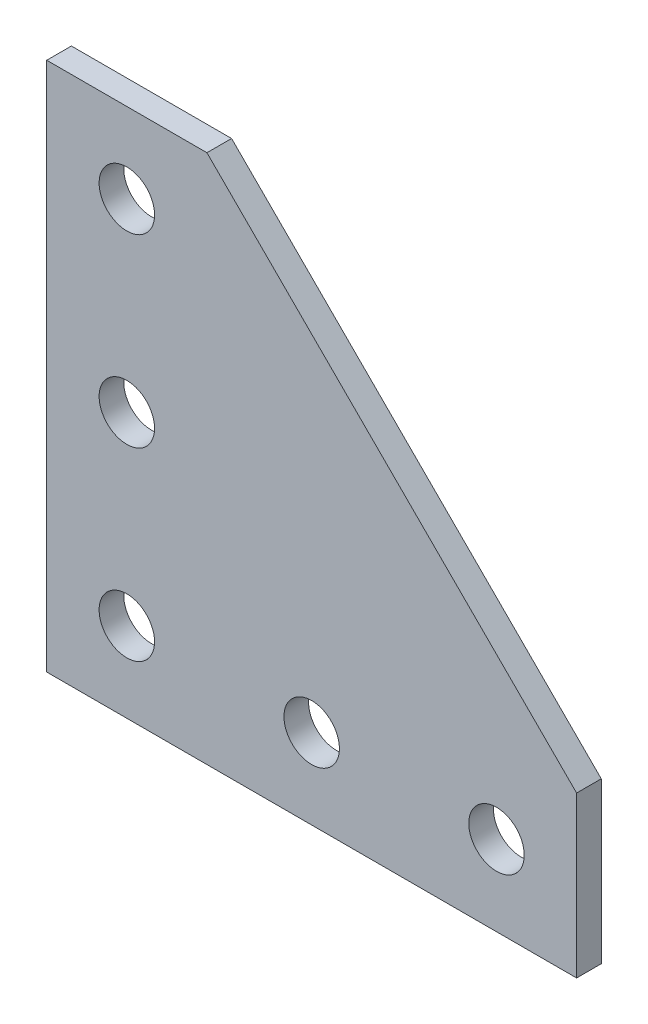
ISO-10303-21;
HEADER;
FILE_DESCRIPTION(('STEP AP214'),'2;1');
FILE_NAME('part.step','',(''),(''),'','','');
FILE_SCHEMA(('AUTOMOTIVE_DESIGN { 1 0 10303 214 1 1 1 1 }'));
ENDSEC;
DATA;
#1=APPLICATION_CONTEXT('core data for automotive mechanical design processes');
#2=APPLICATION_PROTOCOL_DEFINITION('international standard','automotive_design',2000,#1);
#3=PRODUCT_CONTEXT('',#1,'mechanical');
#4=PRODUCT('Part','Part','',(#3));
#5=PRODUCT_RELATED_PRODUCT_CATEGORY('part','',(#4));
#6=PRODUCT_DEFINITION_FORMATION('','',#4);
#7=PRODUCT_DEFINITION_CONTEXT('part definition',#1,'design');
#8=PRODUCT_DEFINITION('design','',#6,#7);
#9=PRODUCT_DEFINITION_SHAPE('','',#8);
#10=(LENGTH_UNIT() NAMED_UNIT(*) SI_UNIT(.MILLI.,.METRE.));
#11=(NAMED_UNIT(*) PLANE_ANGLE_UNIT() SI_UNIT($,.RADIAN.));
#12=(NAMED_UNIT(*) SI_UNIT($,.STERADIAN.) SOLID_ANGLE_UNIT());
#13=UNCERTAINTY_MEASURE_WITH_UNIT(LENGTH_MEASURE(1.E-05),#10,'distance_accuracy_value','');
#14=(GEOMETRIC_REPRESENTATION_CONTEXT(3) GLOBAL_UNCERTAINTY_ASSIGNED_CONTEXT((#13)) GLOBAL_UNIT_ASSIGNED_CONTEXT((#10,
#11,#12)) REPRESENTATION_CONTEXT('',''));
#15=CARTESIAN_POINT('',(0.,0.,0.));
#16=DIRECTION('',(0.,0.,1.));
#17=DIRECTION('',(1.,0.,0.));
#18=AXIS2_PLACEMENT_3D('',#15,#16,#17);
#19=CARTESIAN_POINT('',(-88.9000000000006,47.625,3.175));
#20=DIRECTION('',(0.,0.,-1.));
#21=DIRECTION('',(-1.,0.,0.));
#22=AXIS2_PLACEMENT_3D('',#19,#20,#21);
#23=PLANE('',#22);
#24=DIRECTION('',(0.,-1.,0.));
#25=VECTOR('',#24,1.);
#26=CARTESIAN_POINT('',(-88.9000000000006,-88.9,3.175));
#27=LINE('',#26,#25);
#28=CARTESIAN_POINT('',(-88.9000000000006,47.625,3.175));
#29=VERTEX_POINT('',#28);
#30=CARTESIAN_POINT('',(-88.9000000000006,-88.9,3.175));
#31=VERTEX_POINT('',#30);
#32=EDGE_CURVE('E135',#29,#31,#27,.T.);
#33=ORIENTED_EDGE('',*,*,#32,.T.);
#34=DIRECTION('',(1.,0.,0.));
#35=VECTOR('',#34,1.);
#36=CARTESIAN_POINT('',(47.6250000000006,-88.9,3.175));
#37=LINE('',#36,#35);
#38=CARTESIAN_POINT('',(47.6250000000006,-88.9,3.175));
#39=VERTEX_POINT('',#38);
#40=EDGE_CURVE('E93',#31,#39,#37,.T.);
#41=ORIENTED_EDGE('',*,*,#40,.T.);
#42=DIRECTION('',(0.,1.,0.));
#43=VECTOR('',#42,1.);
#44=CARTESIAN_POINT('',(47.6250000000006,-47.625,3.175));
#45=LINE('',#44,#43);
#46=CARTESIAN_POINT('',(47.6250000000006,-47.625,3.175));
#47=VERTEX_POINT('',#46);
#48=EDGE_CURVE('E97',#39,#47,#45,.T.);
#49=ORIENTED_EDGE('',*,*,#48,.T.);
#50=DIRECTION('',(-0.707106781186552,0.707106781186543,0.));
#51=VECTOR('',#50,1.);
#52=CARTESIAN_POINT('',(-47.6250000000006,47.625,3.175));
#53=LINE('',#52,#51);
#54=CARTESIAN_POINT('',(-47.6250000000006,47.625,3.175));
#55=VERTEX_POINT('',#54);
#56=EDGE_CURVE('E101',#47,#55,#53,.T.);
#57=ORIENTED_EDGE('',*,*,#56,.T.);
#58=DIRECTION('',(-1.,0.,0.));
#59=VECTOR('',#58,1.);
#60=CARTESIAN_POINT('',(-88.9000000000006,47.625,3.175));
#61=LINE('',#60,#59);
#62=EDGE_CURVE('E59',#55,#29,#61,.T.);
#63=ORIENTED_EDGE('',*,*,#62,.T.);
#64=EDGE_LOOP('',(#33,#41,#49,#57,#63));
#65=FACE_BOUND('',#64,.T.);
#66=CARTESIAN_POINT('',(-68.2625000000005,-68.2625,3.175));
#67=DIRECTION('',(0.,0.,1.));
#68=DIRECTION('',(1.,0.,0.));
#69=AXIS2_PLACEMENT_3D('',#66,#67,#68);
#70=CIRCLE('',#69,7.14374999999999);
#71=CARTESIAN_POINT('',(-61.1187500000005,-68.2625,3.175));
#72=VERTEX_POINT('',#71);
#73=EDGE_CURVE('E126',#72,#72,#70,.T.);
#74=ORIENTED_EDGE('',*,*,#73,.F.);
#75=EDGE_LOOP('',(#74));
#76=FACE_BOUND('',#75,.T.);
#77=CARTESIAN_POINT('',(-68.2625000000006,-20.6375,3.175));
#78=DIRECTION('',(0.,0.,1.));
#79=DIRECTION('',(1.,0.,0.));
#80=AXIS2_PLACEMENT_3D('',#77,#78,#79);
#81=CIRCLE('',#80,7.14375);
#82=CARTESIAN_POINT('',(-61.1187500000006,-20.6375,3.175));
#83=VERTEX_POINT('',#82);
#84=EDGE_CURVE('E213',#83,#83,#81,.T.);
#85=ORIENTED_EDGE('',*,*,#84,.F.);
#86=EDGE_LOOP('',(#85));
#87=FACE_BOUND('',#86,.T.);
#88=CARTESIAN_POINT('',(-68.2625000000006,26.9875,3.175));
#89=DIRECTION('',(0.,0.,1.));
#90=DIRECTION('',(1.,0.,0.));
#91=AXIS2_PLACEMENT_3D('',#88,#89,#90);
#92=CIRCLE('',#91,7.14375);
#93=CARTESIAN_POINT('',(-61.1187500000006,26.9875,3.175));
#94=VERTEX_POINT('',#93);
#95=EDGE_CURVE('E205',#94,#94,#92,.T.);
#96=ORIENTED_EDGE('',*,*,#95,.F.);
#97=EDGE_LOOP('',(#96));
#98=FACE_BOUND('',#97,.T.);
#99=CARTESIAN_POINT('',(-20.6375000000005,-68.2625,3.175));
#100=DIRECTION('',(0.,0.,1.));
#101=DIRECTION('',(1.,0.,0.));
#102=AXIS2_PLACEMENT_3D('',#99,#100,#101);
#103=CIRCLE('',#102,7.14375);
#104=CARTESIAN_POINT('',(-13.4937500000005,-68.2625,3.175));
#105=VERTEX_POINT('',#104);
#106=EDGE_CURVE('E197',#105,#105,#103,.T.);
#107=ORIENTED_EDGE('',*,*,#106,.F.);
#108=EDGE_LOOP('',(#107));
#109=FACE_BOUND('',#108,.T.);
#110=CARTESIAN_POINT('',(26.9874999999995,-68.2625,3.175));
#111=DIRECTION('',(0.,0.,1.));
#112=DIRECTION('',(1.,0.,0.));
#113=AXIS2_PLACEMENT_3D('',#110,#111,#112);
#114=CIRCLE('',#113,7.14374999999999);
#115=CARTESIAN_POINT('',(34.1312499999995,-68.2625,3.175));
#116=VERTEX_POINT('',#115);
#117=EDGE_CURVE('E186',#116,#116,#114,.T.);
#118=ORIENTED_EDGE('',*,*,#117,.F.);
#119=EDGE_LOOP('',(#118));
#120=FACE_BOUND('',#119,.T.);
#121=ADVANCED_FACE('F41',(#65,#76,#87,#98,#109,#120),#23,.F.);
#122=CARTESIAN_POINT('',(-88.9000000000006,47.625,-3.175));
#123=DIRECTION('',(0.,0.,-1.));
#124=DIRECTION('',(-1.,0.,0.));
#125=AXIS2_PLACEMENT_3D('',#122,#123,#124);
#126=PLANE('',#125);
#127=CARTESIAN_POINT('',(-20.6375000000005,-68.2625,-3.175));
#128=DIRECTION('',(0.,0.,1.));
#129=DIRECTION('',(1.,0.,0.));
#130=AXIS2_PLACEMENT_3D('',#127,#128,#129);
#131=CIRCLE('',#130,7.14375);
#132=CARTESIAN_POINT('',(-13.4937500000005,-68.2625,-3.175));
#133=VERTEX_POINT('',#132);
#134=EDGE_CURVE('E194',#133,#133,#131,.T.);
#135=ORIENTED_EDGE('',*,*,#134,.T.);
#136=EDGE_LOOP('',(#135));
#137=FACE_BOUND('',#136,.T.);
#138=CARTESIAN_POINT('',(-68.2625000000006,-20.6375,-3.175));
#139=DIRECTION('',(0.,0.,1.));
#140=DIRECTION('',(1.,0.,0.));
#141=AXIS2_PLACEMENT_3D('',#138,#139,#140);
#142=CIRCLE('',#141,7.14375);
#143=CARTESIAN_POINT('',(-61.1187500000006,-20.6375,-3.175));
#144=VERTEX_POINT('',#143);
#145=EDGE_CURVE('E209',#144,#144,#142,.T.);
#146=ORIENTED_EDGE('',*,*,#145,.T.);
#147=EDGE_LOOP('',(#146));
#148=FACE_BOUND('',#147,.T.);
#149=DIRECTION('',(0.,-1.,0.));
#150=VECTOR('',#149,1.);
#151=CARTESIAN_POINT('',(-88.9000000000006,-88.9,-3.175));
#152=LINE('',#151,#150);
#153=CARTESIAN_POINT('',(-88.9000000000006,47.625,-3.175));
#154=VERTEX_POINT('',#153);
#155=CARTESIAN_POINT('',(-88.9000000000006,-88.9,-3.175));
#156=VERTEX_POINT('',#155);
#157=EDGE_CURVE('E121',#154,#156,#152,.T.);
#158=ORIENTED_EDGE('',*,*,#157,.F.);
#159=DIRECTION('',(-1.,0.,0.));
#160=VECTOR('',#159,1.);
#161=CARTESIAN_POINT('',(-88.9000000000006,47.625,-3.175));
#162=LINE('',#161,#160);
#163=CARTESIAN_POINT('',(-47.6250000000006,47.625,-3.175));
#164=VERTEX_POINT('',#163);
#165=EDGE_CURVE('E85',#164,#154,#162,.T.);
#166=ORIENTED_EDGE('',*,*,#165,.F.);
#167=DIRECTION('',(-0.707106781186552,0.707106781186543,0.));
#168=VECTOR('',#167,1.);
#169=CARTESIAN_POINT('',(-47.6250000000006,47.625,-3.175));
#170=LINE('',#169,#168);
#171=CARTESIAN_POINT('',(47.6250000000006,-47.625,-3.175));
#172=VERTEX_POINT('',#171);
#173=EDGE_CURVE('E79',#172,#164,#170,.T.);
#174=ORIENTED_EDGE('',*,*,#173,.F.);
#175=DIRECTION('',(0.,1.,0.));
#176=VECTOR('',#175,1.);
#177=CARTESIAN_POINT('',(47.6250000000006,-47.625,-3.175));
#178=LINE('',#177,#176);
#179=CARTESIAN_POINT('',(47.6250000000006,-88.9,-3.175));
#180=VERTEX_POINT('',#179);
#181=EDGE_CURVE('E109',#180,#172,#178,.T.);
#182=ORIENTED_EDGE('',*,*,#181,.F.);
#183=DIRECTION('',(1.,0.,0.));
#184=VECTOR('',#183,1.);
#185=CARTESIAN_POINT('',(47.6250000000006,-88.9,-3.175));
#186=LINE('',#185,#184);
#187=EDGE_CURVE('E125',#156,#180,#186,.T.);
#188=ORIENTED_EDGE('',*,*,#187,.F.);
#189=EDGE_LOOP('',(#158,#166,#174,#182,#188));
#190=FACE_BOUND('',#189,.T.);
#191=CARTESIAN_POINT('',(-68.2625000000005,-68.2625,-3.175));
#192=DIRECTION('',(0.,0.,1.));
#193=DIRECTION('',(1.,0.,0.));
#194=AXIS2_PLACEMENT_3D('',#191,#192,#193);
#195=CIRCLE('',#194,7.14374999999999);
#196=CARTESIAN_POINT('',(-61.1187500000005,-68.2625,-3.175));
#197=VERTEX_POINT('',#196);
#198=EDGE_CURVE('E217',#197,#197,#195,.T.);
#199=ORIENTED_EDGE('',*,*,#198,.T.);
#200=EDGE_LOOP('',(#199));
#201=FACE_BOUND('',#200,.T.);
#202=CARTESIAN_POINT('',(-68.2625000000006,26.9875,-3.175));
#203=DIRECTION('',(0.,0.,1.));
#204=DIRECTION('',(1.,0.,0.));
#205=AXIS2_PLACEMENT_3D('',#202,#203,#204);
#206=CIRCLE('',#205,7.14375);
#207=CARTESIAN_POINT('',(-61.1187500000006,26.9875,-3.175));
#208=VERTEX_POINT('',#207);
#209=EDGE_CURVE('E201',#208,#208,#206,.T.);
#210=ORIENTED_EDGE('',*,*,#209,.T.);
#211=EDGE_LOOP('',(#210));
#212=FACE_BOUND('',#211,.T.);
#213=CARTESIAN_POINT('',(26.9874999999995,-68.2625,-3.175));
#214=DIRECTION('',(0.,0.,1.));
#215=DIRECTION('',(1.,0.,0.));
#216=AXIS2_PLACEMENT_3D('',#213,#214,#215);
#217=CIRCLE('',#216,7.14374999999999);
#218=CARTESIAN_POINT('',(34.1312499999995,-68.2625,-3.175));
#219=VERTEX_POINT('',#218);
#220=EDGE_CURVE('E189',#219,#219,#217,.T.);
#221=ORIENTED_EDGE('',*,*,#220,.T.);
#222=EDGE_LOOP('',(#221));
#223=FACE_BOUND('',#222,.T.);
#224=ADVANCED_FACE('F142',(#137,#148,#190,#201,#212,#223),#126,.T.);
#225=CARTESIAN_POINT('',(-88.9000000000006,-88.9,3.175));
#226=DIRECTION('',(1.,0.,0.));
#227=DIRECTION('',(0.,0.,-1.));
#228=AXIS2_PLACEMENT_3D('',#225,#226,#227);
#229=PLANE('',#228);
#230=ORIENTED_EDGE('',*,*,#157,.T.);
#231=DIRECTION('',(0.,0.,-1.));
#232=VECTOR('',#231,1.);
#233=CARTESIAN_POINT('',(-88.9000000000006,-88.9,3.175));
#234=LINE('',#233,#232);
#235=EDGE_CURVE('E11',#31,#156,#234,.T.);
#236=ORIENTED_EDGE('',*,*,#235,.F.);
#237=ORIENTED_EDGE('',*,*,#32,.F.);
#238=DIRECTION('',(0.,0.,-1.));
#239=VECTOR('',#238,1.);
#240=CARTESIAN_POINT('',(-88.9000000000006,47.625,3.175));
#241=LINE('',#240,#239);
#242=EDGE_CURVE('E117',#29,#154,#241,.T.);
#243=ORIENTED_EDGE('',*,*,#242,.T.);
#244=EDGE_LOOP('',(#230,#236,#237,#243));
#245=FACE_BOUND('',#244,.T.);
#246=ADVANCED_FACE('F43',(#245),#229,.F.);
#247=CARTESIAN_POINT('',(47.6250000000006,-88.9,3.175));
#248=DIRECTION('',(0.,1.,0.));
#249=DIRECTION('',(-1.,0.,0.));
#250=AXIS2_PLACEMENT_3D('',#247,#248,#249);
#251=PLANE('',#250);
#252=ORIENTED_EDGE('',*,*,#187,.T.);
#253=DIRECTION('',(0.,0.,-1.));
#254=VECTOR('',#253,1.);
#255=CARTESIAN_POINT('',(47.6250000000006,-88.9,3.175));
#256=LINE('',#255,#254);
#257=EDGE_CURVE('E51',#39,#180,#256,.T.);
#258=ORIENTED_EDGE('',*,*,#257,.F.);
#259=ORIENTED_EDGE('',*,*,#40,.F.);
#260=ORIENTED_EDGE('',*,*,#235,.T.);
#261=EDGE_LOOP('',(#252,#258,#259,#260));
#262=FACE_BOUND('',#261,.T.);
#263=ADVANCED_FACE('F282',(#262),#251,.F.);
#264=CARTESIAN_POINT('',(47.6250000000006,-47.625,3.175));
#265=DIRECTION('',(-1.,0.,0.));
#266=DIRECTION('',(0.,0.,1.));
#267=AXIS2_PLACEMENT_3D('',#264,#265,#266);
#268=PLANE('',#267);
#269=ORIENTED_EDGE('',*,*,#181,.T.);
#270=DIRECTION('',(0.,0.,-1.));
#271=VECTOR('',#270,1.);
#272=CARTESIAN_POINT('',(47.6250000000006,-47.625,3.175));
#273=LINE('',#272,#271);
#274=EDGE_CURVE('E106',#47,#172,#273,.T.);
#275=ORIENTED_EDGE('',*,*,#274,.F.);
#276=ORIENTED_EDGE('',*,*,#48,.F.);
#277=ORIENTED_EDGE('',*,*,#257,.T.);
#278=EDGE_LOOP('',(#269,#275,#276,#277));
#279=FACE_BOUND('',#278,.T.);
#280=ADVANCED_FACE('F107',(#279),#268,.F.);
#281=CARTESIAN_POINT('',(-47.6250000000006,47.625,3.175));
#282=DIRECTION('',(-0.707106781186543,-0.707106781186552,0.));
#283=DIRECTION('',(0.707106781186552,-0.707106781186543,0.));
#284=AXIS2_PLACEMENT_3D('',#281,#282,#283);
#285=PLANE('',#284);
#286=ORIENTED_EDGE('',*,*,#173,.T.);
#287=DIRECTION('',(0.,0.,-1.));
#288=VECTOR('',#287,1.);
#289=CARTESIAN_POINT('',(-47.6250000000006,47.625,3.175));
#290=LINE('',#289,#288);
#291=EDGE_CURVE('E111',#55,#164,#290,.T.);
#292=ORIENTED_EDGE('',*,*,#291,.F.);
#293=ORIENTED_EDGE('',*,*,#56,.F.);
#294=ORIENTED_EDGE('',*,*,#274,.T.);
#295=EDGE_LOOP('',(#286,#292,#293,#294));
#296=FACE_BOUND('',#295,.T.);
#297=ADVANCED_FACE('F113',(#296),#285,.F.);
#298=CARTESIAN_POINT('',(-88.9000000000006,47.625,3.175));
#299=DIRECTION('',(0.,-1.,0.));
#300=DIRECTION('',(1.,0.,0.));
#301=AXIS2_PLACEMENT_3D('',#298,#299,#300);
#302=PLANE('',#301);
#303=ORIENTED_EDGE('',*,*,#165,.T.);
#304=ORIENTED_EDGE('',*,*,#242,.F.);
#305=ORIENTED_EDGE('',*,*,#62,.F.);
#306=ORIENTED_EDGE('',*,*,#291,.T.);
#307=EDGE_LOOP('',(#303,#304,#305,#306));
#308=FACE_BOUND('',#307,.T.);
#309=ADVANCED_FACE('F147',(#308),#302,.F.);
#310=CARTESIAN_POINT('',(-68.2625000000005,-68.2625,3.175));
#311=DIRECTION('',(0.,0.,-1.));
#312=DIRECTION('',(-1.,0.,0.));
#313=AXIS2_PLACEMENT_3D('',#310,#311,#312);
#314=CYLINDRICAL_SURFACE('',#313,7.14374999999999);
#315=ORIENTED_EDGE('',*,*,#73,.T.);
#316=EDGE_LOOP('',(#315));
#317=FACE_BOUND('',#316,.T.);
#318=ORIENTED_EDGE('',*,*,#198,.F.);
#319=EDGE_LOOP('',(#318));
#320=FACE_BOUND('',#319,.T.);
#321=ADVANCED_FACE('F149',(#317,#320),#314,.F.);
#322=CARTESIAN_POINT('',(-68.2625000000006,-20.6375,3.175));
#323=DIRECTION('',(0.,0.,-1.));
#324=DIRECTION('',(-1.,0.,0.));
#325=AXIS2_PLACEMENT_3D('',#322,#323,#324);
#326=CYLINDRICAL_SURFACE('',#325,7.14375);
#327=ORIENTED_EDGE('',*,*,#84,.T.);
#328=EDGE_LOOP('',(#327));
#329=FACE_BOUND('',#328,.T.);
#330=ORIENTED_EDGE('',*,*,#145,.F.);
#331=EDGE_LOOP('',(#330));
#332=FACE_BOUND('',#331,.T.);
#333=ADVANCED_FACE('F155',(#329,#332),#326,.F.);
#334=CARTESIAN_POINT('',(-68.2625000000006,26.9875,3.175));
#335=DIRECTION('',(0.,0.,-1.));
#336=DIRECTION('',(-1.,0.,0.));
#337=AXIS2_PLACEMENT_3D('',#334,#335,#336);
#338=CYLINDRICAL_SURFACE('',#337,7.14375);
#339=ORIENTED_EDGE('',*,*,#95,.T.);
#340=EDGE_LOOP('',(#339));
#341=FACE_BOUND('',#340,.T.);
#342=ORIENTED_EDGE('',*,*,#209,.F.);
#343=EDGE_LOOP('',(#342));
#344=FACE_BOUND('',#343,.T.);
#345=ADVANCED_FACE('F169',(#341,#344),#338,.F.);
#346=CARTESIAN_POINT('',(-20.6375000000005,-68.2625,3.175));
#347=DIRECTION('',(0.,0.,-1.));
#348=DIRECTION('',(-1.,0.,0.));
#349=AXIS2_PLACEMENT_3D('',#346,#347,#348);
#350=CYLINDRICAL_SURFACE('',#349,7.14375);
#351=ORIENTED_EDGE('',*,*,#106,.T.);
#352=EDGE_LOOP('',(#351));
#353=FACE_BOUND('',#352,.T.);
#354=ORIENTED_EDGE('',*,*,#134,.F.);
#355=EDGE_LOOP('',(#354));
#356=FACE_BOUND('',#355,.T.);
#357=ADVANCED_FACE('F173',(#353,#356),#350,.F.);
#358=CARTESIAN_POINT('',(26.9874999999995,-68.2625,3.175));
#359=DIRECTION('',(0.,0.,-1.));
#360=DIRECTION('',(-1.,0.,0.));
#361=AXIS2_PLACEMENT_3D('',#358,#359,#360);
#362=CYLINDRICAL_SURFACE('',#361,7.14374999999999);
#363=ORIENTED_EDGE('',*,*,#117,.T.);
#364=EDGE_LOOP('',(#363));
#365=FACE_BOUND('',#364,.T.);
#366=ORIENTED_EDGE('',*,*,#220,.F.);
#367=EDGE_LOOP('',(#366));
#368=FACE_BOUND('',#367,.T.);
#369=ADVANCED_FACE('F177',(#365,#368),#362,.F.);
#370=CLOSED_SHELL('',(#121,#224,#246,#263,#280,#297,#309,#321,#333,#345,#357,#369));
#371=MANIFOLD_SOLID_BREP('B2',#370);
#372=ADVANCED_BREP_SHAPE_REPRESENTATION('',(#18,#371),#14);
#373=SHAPE_DEFINITION_REPRESENTATION(#9,#372);
ENDSEC;
END-ISO-10303-21;
